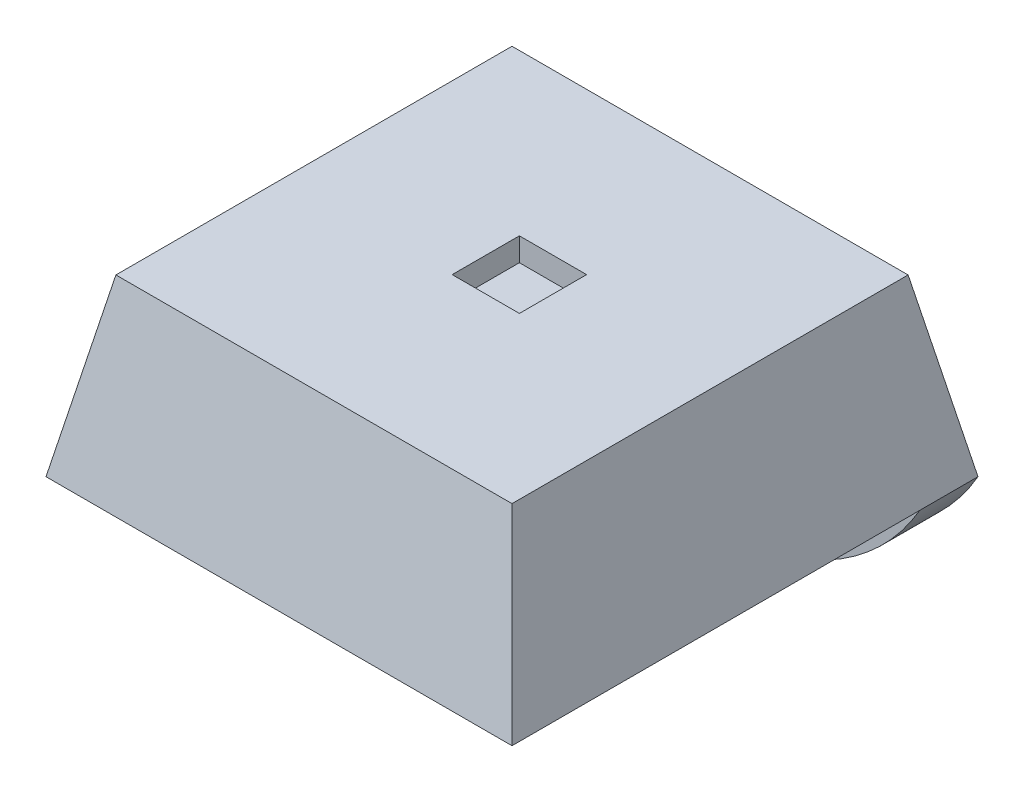
ISO-10303-21;
HEADER;
FILE_DESCRIPTION(('STEP AP214'),'2;1');
FILE_NAME('part.step','',(''),(''),'','','');
FILE_SCHEMA(('AUTOMOTIVE_DESIGN { 1 0 10303 214 1 1 1 1 }'));
ENDSEC;
DATA;
#1=APPLICATION_CONTEXT('core data for automotive mechanical design processes');
#2=APPLICATION_PROTOCOL_DEFINITION('international standard','automotive_design',2000,#1);
#3=PRODUCT_CONTEXT('',#1,'mechanical');
#4=PRODUCT('Part','Part','',(#3));
#5=PRODUCT_RELATED_PRODUCT_CATEGORY('part','',(#4));
#6=PRODUCT_DEFINITION_FORMATION('','',#4);
#7=PRODUCT_DEFINITION_CONTEXT('part definition',#1,'design');
#8=PRODUCT_DEFINITION('design','',#6,#7);
#9=PRODUCT_DEFINITION_SHAPE('','',#8);
#10=(LENGTH_UNIT() NAMED_UNIT(*) SI_UNIT(.MILLI.,.METRE.));
#11=(NAMED_UNIT(*) PLANE_ANGLE_UNIT() SI_UNIT($,.RADIAN.));
#12=(NAMED_UNIT(*) SI_UNIT($,.STERADIAN.) SOLID_ANGLE_UNIT());
#13=UNCERTAINTY_MEASURE_WITH_UNIT(LENGTH_MEASURE(1.E-05),#10,'distance_accuracy_value','');
#14=(GEOMETRIC_REPRESENTATION_CONTEXT(3) GLOBAL_UNCERTAINTY_ASSIGNED_CONTEXT((#13)) GLOBAL_UNIT_ASSIGNED_CONTEXT((#10,
#11,#12)) REPRESENTATION_CONTEXT('',''));
#15=CARTESIAN_POINT('',(0.,0.,0.));
#16=DIRECTION('',(0.,0.,1.));
#17=DIRECTION('',(1.,0.,0.));
#18=AXIS2_PLACEMENT_3D('',#15,#16,#17);
#19=CARTESIAN_POINT('',(0.,3.,0.));
#20=DIRECTION('',(0.,-1.,0.));
#21=DIRECTION('',(0.,0.,-1.));
#22=AXIS2_PLACEMENT_3D('',#19,#20,#21);
#23=PLANE('',#22);
#24=DIRECTION('',(-1.,0.,0.));
#25=VECTOR('',#24,1.);
#26=CARTESIAN_POINT('',(11.,3.,-0.6));
#27=LINE('',#26,#25);
#28=CARTESIAN_POINT('',(7.4,3.,-0.6));
#29=VERTEX_POINT('',#28);
#30=CARTESIAN_POINT('',(0.6,3.,-0.6));
#31=VERTEX_POINT('',#30);
#32=EDGE_CURVE('E180',#29,#31,#27,.T.);
#33=ORIENTED_EDGE('',*,*,#32,.F.);
#34=DIRECTION('',(0.,0.,1.));
#35=VECTOR('',#34,1.);
#36=CARTESIAN_POINT('',(7.4,3.,-8.));
#37=LINE('',#36,#35);
#38=CARTESIAN_POINT('',(7.4,3.,-7.4));
#39=VERTEX_POINT('',#38);
#40=EDGE_CURVE('E193',#39,#29,#37,.T.);
#41=ORIENTED_EDGE('',*,*,#40,.F.);
#42=DIRECTION('',(-1.,0.,0.));
#43=VECTOR('',#42,1.);
#44=CARTESIAN_POINT('',(11.,3.,-7.4));
#45=LINE('',#44,#43);
#46=CARTESIAN_POINT('',(0.599999999999999,3.,-7.4));
#47=VERTEX_POINT('',#46);
#48=EDGE_CURVE('E176',#39,#47,#45,.T.);
#49=ORIENTED_EDGE('',*,*,#48,.T.);
#50=DIRECTION('',(0.,0.,1.));
#51=VECTOR('',#50,1.);
#52=CARTESIAN_POINT('',(0.6,3.,-8.));
#53=LINE('',#52,#51);
#54=EDGE_CURVE('E196',#47,#31,#53,.T.);
#55=ORIENTED_EDGE('',*,*,#54,.T.);
#56=EDGE_LOOP('',(#33,#41,#49,#55));
#57=FACE_BOUND('',#56,.T.);
#58=DIRECTION('',(-1.,0.,0.));
#59=VECTOR('',#58,1.);
#60=CARTESIAN_POINT('',(4.63573241470774,3.,-3.49105487143866));
#61=LINE('',#60,#59);
#62=CARTESIAN_POINT('',(4.63573241470774,3.,-3.49105487143866));
#63=VERTEX_POINT('',#62);
#64=CARTESIAN_POINT('',(3.48188626086159,3.,-3.49105487143866));
#65=VERTEX_POINT('',#64);
#66=EDGE_CURVE('E58',#63,#65,#61,.T.);
#67=ORIENTED_EDGE('',*,*,#66,.T.);
#68=DIRECTION('',(0.,0.,-1.));
#69=VECTOR('',#68,1.);
#70=CARTESIAN_POINT('',(3.48188626086159,3.,-3.49105487143866));
#71=LINE('',#70,#69);
#72=CARTESIAN_POINT('',(3.48188626086159,3.,-4.64490102528481));
#73=VERTEX_POINT('',#72);
#74=EDGE_CURVE('E148',#65,#73,#71,.T.);
#75=ORIENTED_EDGE('',*,*,#74,.T.);
#76=DIRECTION('',(1.,0.,0.));
#77=VECTOR('',#76,1.);
#78=CARTESIAN_POINT('',(3.48188626086159,3.,-4.64490102528481));
#79=LINE('',#78,#77);
#80=CARTESIAN_POINT('',(4.63573241470774,3.,-4.64490102528481));
#81=VERTEX_POINT('',#80);
#82=EDGE_CURVE('E475',#73,#81,#79,.T.);
#83=ORIENTED_EDGE('',*,*,#82,.T.);
#84=DIRECTION('',(0.,0.,1.));
#85=VECTOR('',#84,1.);
#86=CARTESIAN_POINT('',(4.63573241470774,3.,-4.64490102528481));
#87=LINE('',#86,#85);
#88=EDGE_CURVE('E144',#81,#63,#87,.T.);
#89=ORIENTED_EDGE('',*,*,#88,.T.);
#90=EDGE_LOOP('',(#67,#75,#83,#89));
#91=FACE_BOUND('',#90,.T.);
#92=ADVANCED_FACE('F42',(#57,#91),#23,.F.);
#93=CARTESIAN_POINT('',(8.,0.,-8.));
#94=DIRECTION('',(-0.98058067569092,-0.196116135138184,0.));
#95=DIRECTION('',(0.196116135138184,-0.98058067569092,0.));
#96=AXIS2_PLACEMENT_3D('',#93,#94,#95);
#97=PLANE('',#96);
#98=DIRECTION('',(-0.192450089729875,0.962250448649376,-0.192450089729875));
#99=VECTOR('',#98,1.);
#100=CARTESIAN_POINT('',(7.7037037037037,1.48148148148148,-0.296296296296296));
#101=LINE('',#100,#99);
#102=CARTESIAN_POINT('',(8.,0.,0.));
#103=VERTEX_POINT('',#102);
#104=EDGE_CURVE('E190',#103,#29,#101,.T.);
#105=ORIENTED_EDGE('',*,*,#104,.F.);
#106=DIRECTION('',(0.,0.,-1.));
#107=VECTOR('',#106,1.);
#108=CARTESIAN_POINT('',(8.,0.,0.));
#109=LINE('',#108,#107);
#110=CARTESIAN_POINT('',(8.,0.,-7.));
#111=VERTEX_POINT('',#110);
#112=EDGE_CURVE('E209',#103,#111,#109,.T.);
#113=ORIENTED_EDGE('',*,*,#112,.T.);
#114=DIRECTION('',(0.,0.,1.));
#115=VECTOR('',#114,1.);
#116=CARTESIAN_POINT('',(8.,0.,-8.));
#117=LINE('',#116,#115);
#118=CARTESIAN_POINT('',(8.,0.,-8.));
#119=VERTEX_POINT('',#118);
#120=EDGE_CURVE('E150',#119,#111,#117,.T.);
#121=ORIENTED_EDGE('',*,*,#120,.F.);
#122=DIRECTION('',(0.192450089729875,-0.962250448649376,-0.192450089729875));
#123=VECTOR('',#122,1.);
#124=CARTESIAN_POINT('',(8.,0.,-8.));
#125=LINE('',#124,#123);
#126=EDGE_CURVE('E183',#39,#119,#125,.T.);
#127=ORIENTED_EDGE('',*,*,#126,.F.);
#128=ORIENTED_EDGE('',*,*,#40,.T.);
#129=EDGE_LOOP('',(#105,#113,#121,#127,#128));
#130=FACE_BOUND('',#129,.T.);
#131=ADVANCED_FACE('F277',(#130),#97,.F.);
#132=CARTESIAN_POINT('',(0.,0.,-8.));
#133=DIRECTION('',(0.98058067569092,-0.196116135138184,0.));
#134=DIRECTION('',(0.196116135138184,0.98058067569092,0.));
#135=AXIS2_PLACEMENT_3D('',#132,#133,#134);
#136=PLANE('',#135);
#137=DIRECTION('',(-0.192450089729875,-0.962250448649376,0.192450089729875));
#138=VECTOR('',#137,1.);
#139=CARTESIAN_POINT('',(0.296296296296296,1.48148148148148,-0.296296296296296));
#140=LINE('',#139,#138);
#141=CARTESIAN_POINT('',(0.,0.,0.));
#142=VERTEX_POINT('',#141);
#143=EDGE_CURVE('E237',#31,#142,#140,.T.);
#144=ORIENTED_EDGE('',*,*,#143,.F.);
#145=ORIENTED_EDGE('',*,*,#54,.F.);
#146=DIRECTION('',(0.192450089729875,0.962250448649376,0.192450089729875));
#147=VECTOR('',#146,1.);
#148=CARTESIAN_POINT('',(0.,0.,-8.));
#149=LINE('',#148,#147);
#150=CARTESIAN_POINT('',(0.,0.,-8.));
#151=VERTEX_POINT('',#150);
#152=EDGE_CURVE('E208',#151,#47,#149,.T.);
#153=ORIENTED_EDGE('',*,*,#152,.F.);
#154=DIRECTION('',(0.,0.,1.));
#155=VECTOR('',#154,1.);
#156=CARTESIAN_POINT('',(0.,0.,0.));
#157=LINE('',#156,#155);
#158=CARTESIAN_POINT('',(0.,0.,-7.));
#159=VERTEX_POINT('',#158);
#160=EDGE_CURVE('E213',#151,#159,#157,.T.);
#161=ORIENTED_EDGE('',*,*,#160,.T.);
#162=EDGE_CURVE('E200',#159,#142,#157,.T.);
#163=ORIENTED_EDGE('',*,*,#162,.T.);
#164=EDGE_LOOP('',(#144,#145,#153,#161,#163));
#165=FACE_BOUND('',#164,.T.);
#166=ADVANCED_FACE('F261',(#165),#136,.F.);
#167=CARTESIAN_POINT('',(0.,0.,0.));
#168=DIRECTION('',(0.,-1.,0.));
#169=DIRECTION('',(0.,0.,-1.));
#170=AXIS2_PLACEMENT_3D('',#167,#168,#169);
#171=PLANE('',#170);
#172=DIRECTION('',(-1.,0.,0.));
#173=VECTOR('',#172,1.);
#174=CARTESIAN_POINT('',(0.,0.,-7.));
#175=LINE('',#174,#173);
#176=EDGE_CURVE('E156',#111,#159,#175,.T.);
#177=ORIENTED_EDGE('',*,*,#176,.F.);
#178=ORIENTED_EDGE('',*,*,#112,.F.);
#179=DIRECTION('',(1.,0.,0.));
#180=VECTOR('',#179,1.);
#181=CARTESIAN_POINT('',(0.,0.,0.));
#182=LINE('',#181,#180);
#183=EDGE_CURVE('E210',#142,#103,#182,.T.);
#184=ORIENTED_EDGE('',*,*,#183,.F.);
#185=ORIENTED_EDGE('',*,*,#162,.F.);
#186=EDGE_LOOP('',(#177,#178,#184,#185));
#187=FACE_BOUND('',#186,.T.);
#188=CARTESIAN_POINT('',(4.,0.,-3.75));
#189=DIRECTION('',(0.,-1.,0.));
#190=DIRECTION('',(0.,0.,-1.));
#191=AXIS2_PLACEMENT_3D('',#188,#189,#190);
#192=CIRCLE('',#191,1.8);
#193=CARTESIAN_POINT('',(4.,0.,-5.55));
#194=VERTEX_POINT('',#193);
#195=EDGE_CURVE('E168',#194,#194,#192,.T.);
#196=ORIENTED_EDGE('',*,*,#195,.F.);
#197=EDGE_LOOP('',(#196));
#198=FACE_BOUND('',#197,.T.);
#199=ADVANCED_FACE('F272',(#187,#198),#171,.T.);
#200=CARTESIAN_POINT('',(11.,3.,-7.4));
#201=DIRECTION('',(0.,0.196116135138184,-0.98058067569092));
#202=DIRECTION('',(0.,0.98058067569092,0.196116135138184));
#203=AXIS2_PLACEMENT_3D('',#200,#201,#202);
#204=PLANE('',#203);
#205=ORIENTED_EDGE('',*,*,#126,.T.);
#206=DIRECTION('',(-1.,0.,0.));
#207=VECTOR('',#206,1.);
#208=CARTESIAN_POINT('',(0.,0.,-8.));
#209=LINE('',#208,#207);
#210=EDGE_CURVE('E204',#119,#151,#209,.T.);
#211=ORIENTED_EDGE('',*,*,#210,.T.);
#212=ORIENTED_EDGE('',*,*,#152,.T.);
#213=ORIENTED_EDGE('',*,*,#48,.F.);
#214=EDGE_LOOP('',(#205,#211,#212,#213));
#215=FACE_BOUND('',#214,.T.);
#216=ADVANCED_FACE('F256',(#215),#204,.T.);
#217=CARTESIAN_POINT('',(11.,0.,0.));
#218=DIRECTION('',(0.,0.196116135138184,0.98058067569092));
#219=DIRECTION('',(0.,-0.98058067569092,0.196116135138184));
#220=AXIS2_PLACEMENT_3D('',#217,#218,#219);
#221=PLANE('',#220);
#222=ORIENTED_EDGE('',*,*,#104,.T.);
#223=ORIENTED_EDGE('',*,*,#32,.T.);
#224=ORIENTED_EDGE('',*,*,#143,.T.);
#225=ORIENTED_EDGE('',*,*,#183,.T.);
#226=EDGE_LOOP('',(#222,#223,#224,#225));
#227=FACE_BOUND('',#226,.T.);
#228=ADVANCED_FACE('F303',(#227),#221,.T.);
#229=CARTESIAN_POINT('',(4.,0.8,-3.75));
#230=DIRECTION('',(0.,-1.,0.));
#231=DIRECTION('',(0.,0.,-1.));
#232=AXIS2_PLACEMENT_3D('',#229,#230,#231);
#233=CYLINDRICAL_SURFACE('',#232,1.8);
#234=CARTESIAN_POINT('',(4.,0.8,-3.75));
#235=DIRECTION('',(0.,-1.,0.));
#236=DIRECTION('',(0.,0.,-1.));
#237=AXIS2_PLACEMENT_3D('',#234,#235,#236);
#238=CIRCLE('',#237,1.8);
#239=CARTESIAN_POINT('',(4.,0.8,-5.55));
#240=VERTEX_POINT('',#239);
#241=EDGE_CURVE('E172',#240,#240,#238,.T.);
#242=ORIENTED_EDGE('',*,*,#241,.F.);
#243=EDGE_LOOP('',(#242));
#244=FACE_BOUND('',#243,.T.);
#245=ORIENTED_EDGE('',*,*,#195,.T.);
#246=EDGE_LOOP('',(#245));
#247=FACE_BOUND('',#246,.T.);
#248=ADVANCED_FACE('F310',(#244,#247),#233,.F.);
#249=CARTESIAN_POINT('',(4.,0.8,-3.75));
#250=DIRECTION('',(0.,-1.,0.));
#251=DIRECTION('',(0.,0.,-1.));
#252=AXIS2_PLACEMENT_3D('',#249,#250,#251);
#253=PLANE('',#252);
#254=ORIENTED_EDGE('',*,*,#241,.T.);
#255=EDGE_LOOP('',(#254));
#256=FACE_BOUND('',#255,.T.);
#257=ADVANCED_FACE('F314',(#256),#253,.T.);
#258=CARTESIAN_POINT('',(0.,-2.,-8.));
#259=DIRECTION('',(0.,0.,1.));
#260=DIRECTION('',(1.,0.,0.));
#261=AXIS2_PLACEMENT_3D('',#258,#259,#260);
#262=PLANE('',#261);
#263=ORIENTED_EDGE('',*,*,#210,.F.);
#264=CARTESIAN_POINT('',(4.53589838486225,2.,-8.));
#265=DIRECTION('',(0.,0.,1.));
#266=DIRECTION('',(1.,0.,0.));
#267=AXIS2_PLACEMENT_3D('',#264,#265,#266);
#268=CIRCLE('',#267,4.);
#269=CARTESIAN_POINT('',(4.53589838486225,-2.,-8.));
#270=VERTEX_POINT('',#269);
#271=EDGE_CURVE('E11',#119,#270,#268,.F.);
#272=ORIENTED_EDGE('',*,*,#271,.T.);
#273=DIRECTION('',(1.,0.,0.));
#274=VECTOR('',#273,1.);
#275=CARTESIAN_POINT('',(0.,-2.,-8.));
#276=LINE('',#275,#274);
#277=CARTESIAN_POINT('',(3.46410161513775,-2.,-8.));
#278=VERTEX_POINT('',#277);
#279=EDGE_CURVE('E162',#278,#270,#276,.T.);
#280=ORIENTED_EDGE('',*,*,#279,.F.);
#281=CARTESIAN_POINT('',(3.46410161513775,2.,-8.));
#282=DIRECTION('',(0.,0.,1.));
#283=DIRECTION('',(1.,0.,0.));
#284=AXIS2_PLACEMENT_3D('',#281,#282,#283);
#285=CIRCLE('',#284,4.);
#286=EDGE_CURVE('E51',#278,#151,#285,.F.);
#287=ORIENTED_EDGE('',*,*,#286,.T.);
#288=EDGE_LOOP('',(#263,#272,#280,#287));
#289=FACE_BOUND('',#288,.T.);
#290=ADVANCED_FACE('F249',(#289),#262,.F.);
#291=CARTESIAN_POINT('',(0.,-2.,-7.));
#292=DIRECTION('',(0.,0.,-1.));
#293=DIRECTION('',(-1.,0.,0.));
#294=AXIS2_PLACEMENT_3D('',#291,#292,#293);
#295=PLANE('',#294);
#296=DIRECTION('',(-1.,0.,0.));
#297=VECTOR('',#296,1.);
#298=CARTESIAN_POINT('',(0.,-2.,-7.));
#299=LINE('',#298,#297);
#300=CARTESIAN_POINT('',(4.53589838486225,-2.,-7.));
#301=VERTEX_POINT('',#300);
#302=CARTESIAN_POINT('',(3.46410161513775,-2.,-7.));
#303=VERTEX_POINT('',#302);
#304=EDGE_CURVE('E166',#301,#303,#299,.T.);
#305=ORIENTED_EDGE('',*,*,#304,.F.);
#306=CARTESIAN_POINT('',(4.53589838486225,2.,-7.));
#307=DIRECTION('',(0.,0.,-1.));
#308=DIRECTION('',(-1.,0.,0.));
#309=AXIS2_PLACEMENT_3D('',#306,#307,#308);
#310=CIRCLE('',#309,4.);
#311=EDGE_CURVE('E243',#301,#111,#310,.F.);
#312=ORIENTED_EDGE('',*,*,#311,.T.);
#313=ORIENTED_EDGE('',*,*,#176,.T.);
#314=CARTESIAN_POINT('',(3.46410161513775,2.,-7.));
#315=DIRECTION('',(0.,0.,-1.));
#316=DIRECTION('',(-1.,0.,0.));
#317=AXIS2_PLACEMENT_3D('',#314,#315,#316);
#318=CIRCLE('',#317,4.);
#319=EDGE_CURVE('E66',#159,#303,#318,.F.);
#320=ORIENTED_EDGE('',*,*,#319,.T.);
#321=EDGE_LOOP('',(#305,#312,#313,#320));
#322=FACE_BOUND('',#321,.T.);
#323=ADVANCED_FACE('F267',(#322),#295,.F.);
#324=CARTESIAN_POINT('',(0.,-2.,0.));
#325=DIRECTION('',(0.,1.,0.));
#326=DIRECTION('',(0.,0.,1.));
#327=AXIS2_PLACEMENT_3D('',#324,#325,#326);
#328=PLANE('',#327);
#329=ORIENTED_EDGE('',*,*,#279,.T.);
#330=DIRECTION('',(0.,0.,1.));
#331=VECTOR('',#330,1.);
#332=CARTESIAN_POINT('',(4.53589838486225,-2.,0.));
#333=LINE('',#332,#331);
#334=EDGE_CURVE('E236',#270,#301,#333,.T.);
#335=ORIENTED_EDGE('',*,*,#334,.T.);
#336=ORIENTED_EDGE('',*,*,#304,.T.);
#337=DIRECTION('',(0.,0.,-1.));
#338=VECTOR('',#337,1.);
#339=CARTESIAN_POINT('',(3.46410161513775,-2.,0.));
#340=LINE('',#339,#338);
#341=EDGE_CURVE('E232',#303,#278,#340,.T.);
#342=ORIENTED_EDGE('',*,*,#341,.T.);
#343=EDGE_LOOP('',(#329,#335,#336,#342));
#344=FACE_BOUND('',#343,.T.);
#345=ADVANCED_FACE('F265',(#344),#328,.F.);
#346=CARTESIAN_POINT('',(4.53589838486225,2.,-8.));
#347=DIRECTION('',(0.,0.,1.));
#348=DIRECTION('',(1.,0.,0.));
#349=AXIS2_PLACEMENT_3D('',#346,#347,#348);
#350=CYLINDRICAL_SURFACE('',#349,4.);
#351=ORIENTED_EDGE('',*,*,#271,.F.);
#352=ORIENTED_EDGE('',*,*,#120,.T.);
#353=ORIENTED_EDGE('',*,*,#311,.F.);
#354=ORIENTED_EDGE('',*,*,#334,.F.);
#355=EDGE_LOOP('',(#351,#352,#353,#354));
#356=FACE_BOUND('',#355,.T.);
#357=ADVANCED_FACE('F278',(#356),#350,.T.);
#358=CARTESIAN_POINT('',(3.46410161513775,2.,-8.));
#359=DIRECTION('',(0.,0.,-1.));
#360=DIRECTION('',(-1.,0.,0.));
#361=AXIS2_PLACEMENT_3D('',#358,#359,#360);
#362=CYLINDRICAL_SURFACE('',#361,4.);
#363=ORIENTED_EDGE('',*,*,#319,.F.);
#364=ORIENTED_EDGE('',*,*,#160,.F.);
#365=ORIENTED_EDGE('',*,*,#286,.F.);
#366=ORIENTED_EDGE('',*,*,#341,.F.);
#367=EDGE_LOOP('',(#363,#364,#365,#366));
#368=FACE_BOUND('',#367,.T.);
#369=ADVANCED_FACE('F44',(#368),#362,.T.);
#370=CARTESIAN_POINT('',(4.63573241470774,2.6,-3.49105487143866));
#371=DIRECTION('',(0.,0.,-1.));
#372=DIRECTION('',(-1.,0.,0.));
#373=AXIS2_PLACEMENT_3D('',#370,#371,#372);
#374=PLANE('',#373);
#375=ORIENTED_EDGE('',*,*,#66,.F.);
#376=DIRECTION('',(0.,1.,0.));
#377=VECTOR('',#376,1.);
#378=CARTESIAN_POINT('',(4.63573241470774,2.6,-3.49105487143866));
#379=LINE('',#378,#377);
#380=CARTESIAN_POINT('',(4.63573241470774,2.6,-3.49105487143866));
#381=VERTEX_POINT('',#380);
#382=EDGE_CURVE('E142',#381,#63,#379,.T.);
#383=ORIENTED_EDGE('',*,*,#382,.F.);
#384=DIRECTION('',(-1.,0.,0.));
#385=VECTOR('',#384,1.);
#386=CARTESIAN_POINT('',(4.63573241470774,2.6,-3.49105487143866));
#387=LINE('',#386,#385);
#388=CARTESIAN_POINT('',(3.48188626086159,2.6,-3.49105487143866));
#389=VERTEX_POINT('',#388);
#390=EDGE_CURVE('E133',#381,#389,#387,.T.);
#391=ORIENTED_EDGE('',*,*,#390,.T.);
#392=DIRECTION('',(0.,1.,0.));
#393=VECTOR('',#392,1.);
#394=CARTESIAN_POINT('',(3.48188626086159,2.6,-3.49105487143866));
#395=LINE('',#394,#393);
#396=EDGE_CURVE('E141',#389,#65,#395,.T.);
#397=ORIENTED_EDGE('',*,*,#396,.T.);
#398=EDGE_LOOP('',(#375,#383,#391,#397));
#399=FACE_BOUND('',#398,.T.);
#400=ADVANCED_FACE('F140',(#399),#374,.T.);
#401=CARTESIAN_POINT('',(3.48188626086159,2.6,-3.49105487143866));
#402=DIRECTION('',(1.,0.,0.));
#403=DIRECTION('',(0.,0.,-1.));
#404=AXIS2_PLACEMENT_3D('',#401,#402,#403);
#405=PLANE('',#404);
#406=ORIENTED_EDGE('',*,*,#74,.F.);
#407=ORIENTED_EDGE('',*,*,#396,.F.);
#408=DIRECTION('',(0.,0.,-1.));
#409=VECTOR('',#408,1.);
#410=CARTESIAN_POINT('',(3.48188626086159,2.6,-3.49105487143866));
#411=LINE('',#410,#409);
#412=CARTESIAN_POINT('',(3.48188626086159,2.6,-4.64490102528481));
#413=VERTEX_POINT('',#412);
#414=EDGE_CURVE('E129',#389,#413,#411,.T.);
#415=ORIENTED_EDGE('',*,*,#414,.T.);
#416=DIRECTION('',(0.,1.,0.));
#417=VECTOR('',#416,1.);
#418=CARTESIAN_POINT('',(3.48188626086159,2.6,-4.64490102528481));
#419=LINE('',#418,#417);
#420=EDGE_CURVE('E151',#413,#73,#419,.T.);
#421=ORIENTED_EDGE('',*,*,#420,.T.);
#422=EDGE_LOOP('',(#406,#407,#415,#421));
#423=FACE_BOUND('',#422,.T.);
#424=ADVANCED_FACE('F146',(#423),#405,.T.);
#425=CARTESIAN_POINT('',(3.48188626086159,2.6,-4.64490102528481));
#426=DIRECTION('',(0.,0.,1.));
#427=DIRECTION('',(1.,0.,0.));
#428=AXIS2_PLACEMENT_3D('',#425,#426,#427);
#429=PLANE('',#428);
#430=ORIENTED_EDGE('',*,*,#82,.F.);
#431=ORIENTED_EDGE('',*,*,#420,.F.);
#432=DIRECTION('',(1.,0.,0.));
#433=VECTOR('',#432,1.);
#434=CARTESIAN_POINT('',(3.48188626086159,2.6,-4.64490102528481));
#435=LINE('',#434,#433);
#436=CARTESIAN_POINT('',(4.63573241470774,2.6,-4.64490102528481));
#437=VERTEX_POINT('',#436);
#438=EDGE_CURVE('E134',#413,#437,#435,.T.);
#439=ORIENTED_EDGE('',*,*,#438,.T.);
#440=DIRECTION('',(0.,1.,0.));
#441=VECTOR('',#440,1.);
#442=CARTESIAN_POINT('',(4.63573241470774,2.6,-4.64490102528481));
#443=LINE('',#442,#441);
#444=EDGE_CURVE('E158',#437,#81,#443,.T.);
#445=ORIENTED_EDGE('',*,*,#444,.T.);
#446=EDGE_LOOP('',(#430,#431,#439,#445));
#447=FACE_BOUND('',#446,.T.);
#448=ADVANCED_FACE('F327',(#447),#429,.T.);
#449=CARTESIAN_POINT('',(4.63573241470774,2.6,-4.64490102528481));
#450=DIRECTION('',(-1.,0.,0.));
#451=DIRECTION('',(0.,0.,1.));
#452=AXIS2_PLACEMENT_3D('',#449,#450,#451);
#453=PLANE('',#452);
#454=ORIENTED_EDGE('',*,*,#88,.F.);
#455=ORIENTED_EDGE('',*,*,#444,.F.);
#456=DIRECTION('',(0.,0.,1.));
#457=VECTOR('',#456,1.);
#458=CARTESIAN_POINT('',(4.63573241470774,2.6,-4.64490102528481));
#459=LINE('',#458,#457);
#460=EDGE_CURVE('E485',#437,#381,#459,.T.);
#461=ORIENTED_EDGE('',*,*,#460,.T.);
#462=ORIENTED_EDGE('',*,*,#382,.T.);
#463=EDGE_LOOP('',(#454,#455,#461,#462));
#464=FACE_BOUND('',#463,.T.);
#465=ADVANCED_FACE('F330',(#464),#453,.T.);
#466=CARTESIAN_POINT('',(0.,2.6,0.));
#467=DIRECTION('',(0.,-1.,0.));
#468=DIRECTION('',(0.,0.,-1.));
#469=AXIS2_PLACEMENT_3D('',#466,#467,#468);
#470=PLANE('',#469);
#471=ORIENTED_EDGE('',*,*,#390,.F.);
#472=ORIENTED_EDGE('',*,*,#460,.F.);
#473=ORIENTED_EDGE('',*,*,#438,.F.);
#474=ORIENTED_EDGE('',*,*,#414,.F.);
#475=EDGE_LOOP('',(#471,#472,#473,#474));
#476=FACE_BOUND('',#475,.T.);
#477=ADVANCED_FACE('F131',(#476),#470,.F.);
#478=CLOSED_SHELL('',(#92,#131,#166,#199,#216,#228,#248,#257,#290,#323,#345,#357,#369,#400,#424,
#448,#465,#477));
#479=MANIFOLD_SOLID_BREP('B2',#478);
#480=ADVANCED_BREP_SHAPE_REPRESENTATION('',(#18,#479),#14);
#481=SHAPE_DEFINITION_REPRESENTATION(#9,#480);
ENDSEC;
END-ISO-10303-21;
